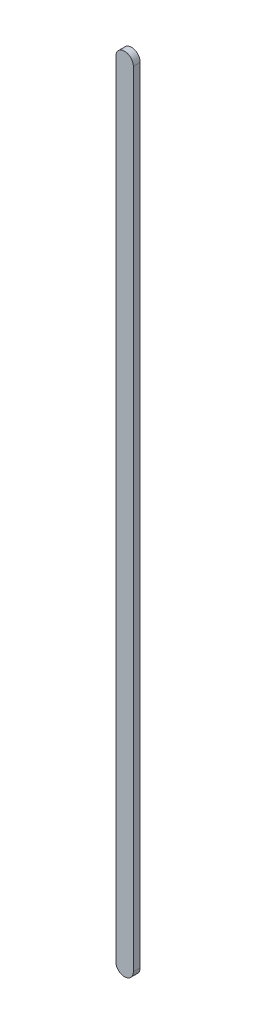
ISO-10303-21;
HEADER;
FILE_DESCRIPTION(('STEP AP214'),'2;1');
FILE_NAME('part.step','',(''),(''),'','','');
FILE_SCHEMA(('AUTOMOTIVE_DESIGN { 1 0 10303 214 1 1 1 1 }'));
ENDSEC;
DATA;
#1=APPLICATION_CONTEXT('core data for automotive mechanical design processes');
#2=APPLICATION_PROTOCOL_DEFINITION('international standard','automotive_design',2000,#1);
#3=PRODUCT_CONTEXT('',#1,'mechanical');
#4=PRODUCT('Part','Part','',(#3));
#5=PRODUCT_RELATED_PRODUCT_CATEGORY('part','',(#4));
#6=PRODUCT_DEFINITION_FORMATION('','',#4);
#7=PRODUCT_DEFINITION_CONTEXT('part definition',#1,'design');
#8=PRODUCT_DEFINITION('design','',#6,#7);
#9=PRODUCT_DEFINITION_SHAPE('','',#8);
#10=(LENGTH_UNIT() NAMED_UNIT(*) SI_UNIT(.MILLI.,.METRE.));
#11=(NAMED_UNIT(*) PLANE_ANGLE_UNIT() SI_UNIT($,.RADIAN.));
#12=(NAMED_UNIT(*) SI_UNIT($,.STERADIAN.) SOLID_ANGLE_UNIT());
#13=UNCERTAINTY_MEASURE_WITH_UNIT(LENGTH_MEASURE(1.E-05),#10,'distance_accuracy_value','');
#14=(GEOMETRIC_REPRESENTATION_CONTEXT(3) GLOBAL_UNCERTAINTY_ASSIGNED_CONTEXT((#13)) GLOBAL_UNIT_ASSIGNED_CONTEXT((#10,
#11,#12)) REPRESENTATION_CONTEXT('',''));
#15=CARTESIAN_POINT('',(0.,0.,0.));
#16=DIRECTION('',(0.,0.,1.));
#17=DIRECTION('',(1.,0.,0.));
#18=AXIS2_PLACEMENT_3D('',#15,#16,#17);
#19=CARTESIAN_POINT('',(87.63,65.151,0.));
#20=DIRECTION('',(-1.,0.,0.));
#21=DIRECTION('',(0.,1.,0.));
#22=AXIS2_PLACEMENT_3D('',#19,#20,#21);
#23=PLANE('',#22);
#24=DIRECTION('',(0.,1.,0.));
#25=VECTOR('',#24,1.);
#26=CARTESIAN_POINT('',(87.63,65.151,0.1999996));
#27=LINE('',#26,#25);
#28=CARTESIAN_POINT('',(87.63,65.151,0.1999996));
#29=VERTEX_POINT('',#28);
#30=CARTESIAN_POINT('',(87.63,87.884,0.1999996));
#31=VERTEX_POINT('',#30);
#32=EDGE_CURVE('E11',#29,#31,#27,.T.);
#33=ORIENTED_EDGE('',*,*,#32,.F.);
#34=DIRECTION('',(0.,0.,1.));
#35=VECTOR('',#34,1.);
#36=CARTESIAN_POINT('',(87.63,65.151,0.));
#37=LINE('',#36,#35);
#38=CARTESIAN_POINT('',(87.63,65.151,0.));
#39=VERTEX_POINT('',#38);
#40=EDGE_CURVE('E24',#39,#29,#37,.T.);
#41=ORIENTED_EDGE('',*,*,#40,.F.);
#42=DIRECTION('',(0.,1.,0.));
#43=VECTOR('',#42,1.);
#44=CARTESIAN_POINT('',(87.63,65.151,0.));
#45=LINE('',#44,#43);
#46=CARTESIAN_POINT('',(87.63,87.884,0.));
#47=VERTEX_POINT('',#46);
#48=EDGE_CURVE('E75',#39,#47,#45,.T.);
#49=ORIENTED_EDGE('',*,*,#48,.T.);
#50=DIRECTION('',(0.,0.,1.));
#51=VECTOR('',#50,1.);
#52=CARTESIAN_POINT('',(87.63,87.884,0.));
#53=LINE('',#52,#51);
#54=EDGE_CURVE('E37',#47,#31,#53,.T.);
#55=ORIENTED_EDGE('',*,*,#54,.T.);
#56=EDGE_LOOP('',(#33,#41,#49,#55));
#57=FACE_BOUND('',#56,.T.);
#58=ADVANCED_FACE('F17',(#57),#23,.F.);
#59=CARTESIAN_POINT('',(87.376,87.884,0.));
#60=DIRECTION('',(0.,0.,-1.));
#61=DIRECTION('',(1.,0.,0.));
#62=AXIS2_PLACEMENT_3D('',#59,#60,#61);
#63=CYLINDRICAL_SURFACE('',#62,0.254);
#64=CARTESIAN_POINT('',(87.376,87.884,0.1999996));
#65=DIRECTION('',(0.,0.,1.));
#66=DIRECTION('',(1.,0.,0.));
#67=AXIS2_PLACEMENT_3D('',#64,#65,#66);
#68=CIRCLE('',#67,0.254);
#69=CARTESIAN_POINT('',(87.122,87.884,0.1999996));
#70=VERTEX_POINT('',#69);
#71=EDGE_CURVE('E83',#31,#70,#68,.T.);
#72=ORIENTED_EDGE('',*,*,#71,.F.);
#73=ORIENTED_EDGE('',*,*,#54,.F.);
#74=CARTESIAN_POINT('',(87.376,87.884,0.));
#75=DIRECTION('',(0.,0.,1.));
#76=DIRECTION('',(1.,0.,0.));
#77=AXIS2_PLACEMENT_3D('',#74,#75,#76);
#78=CIRCLE('',#77,0.254);
#79=CARTESIAN_POINT('',(87.122,87.884,0.));
#80=VERTEX_POINT('',#79);
#81=EDGE_CURVE('E81',#47,#80,#78,.T.);
#82=ORIENTED_EDGE('',*,*,#81,.T.);
#83=DIRECTION('',(0.,0.,1.));
#84=VECTOR('',#83,1.);
#85=CARTESIAN_POINT('',(87.122,87.884,0.));
#86=LINE('',#85,#84);
#87=EDGE_CURVE('E67',#80,#70,#86,.T.);
#88=ORIENTED_EDGE('',*,*,#87,.T.);
#89=EDGE_LOOP('',(#72,#73,#82,#88));
#90=FACE_BOUND('',#89,.T.);
#91=ADVANCED_FACE('F89',(#90),#63,.T.);
#92=CARTESIAN_POINT('',(87.122,87.884,0.));
#93=DIRECTION('',(1.,0.,0.));
#94=DIRECTION('',(0.,-1.,0.));
#95=AXIS2_PLACEMENT_3D('',#92,#93,#94);
#96=PLANE('',#95);
#97=DIRECTION('',(0.,-1.,0.));
#98=VECTOR('',#97,1.);
#99=CARTESIAN_POINT('',(87.122,87.884,0.1999996));
#100=LINE('',#99,#98);
#101=CARTESIAN_POINT('',(87.122,65.151,0.1999996));
#102=VERTEX_POINT('',#101);
#103=EDGE_CURVE('E71',#70,#102,#100,.T.);
#104=ORIENTED_EDGE('',*,*,#103,.F.);
#105=ORIENTED_EDGE('',*,*,#87,.F.);
#106=DIRECTION('',(0.,-1.,0.));
#107=VECTOR('',#106,1.);
#108=CARTESIAN_POINT('',(87.122,87.884,0.));
#109=LINE('',#108,#107);
#110=CARTESIAN_POINT('',(87.122,65.151,0.));
#111=VERTEX_POINT('',#110);
#112=EDGE_CURVE('E63',#80,#111,#109,.T.);
#113=ORIENTED_EDGE('',*,*,#112,.T.);
#114=DIRECTION('',(0.,0.,1.));
#115=VECTOR('',#114,1.);
#116=CARTESIAN_POINT('',(87.122,65.151,0.));
#117=LINE('',#116,#115);
#118=EDGE_CURVE('E53',#111,#102,#117,.T.);
#119=ORIENTED_EDGE('',*,*,#118,.T.);
#120=EDGE_LOOP('',(#104,#105,#113,#119));
#121=FACE_BOUND('',#120,.T.);
#122=ADVANCED_FACE('F66',(#121),#96,.F.);
#123=CARTESIAN_POINT('',(87.376,65.151,0.));
#124=DIRECTION('',(0.,0.,-1.));
#125=DIRECTION('',(-1.,0.,0.));
#126=AXIS2_PLACEMENT_3D('',#123,#124,#125);
#127=CYLINDRICAL_SURFACE('',#126,0.254);
#128=CARTESIAN_POINT('',(87.376,65.151,0.1999996));
#129=DIRECTION('',(0.,0.,1.));
#130=DIRECTION('',(-1.,0.,0.));
#131=AXIS2_PLACEMENT_3D('',#128,#129,#130);
#132=CIRCLE('',#131,0.254);
#133=EDGE_CURVE('E59',#102,#29,#132,.T.);
#134=ORIENTED_EDGE('',*,*,#133,.F.);
#135=ORIENTED_EDGE('',*,*,#118,.F.);
#136=CARTESIAN_POINT('',(87.376,65.151,0.));
#137=DIRECTION('',(0.,0.,1.));
#138=DIRECTION('',(-1.,0.,0.));
#139=AXIS2_PLACEMENT_3D('',#136,#137,#138);
#140=CIRCLE('',#139,0.254);
#141=EDGE_CURVE('E57',#111,#39,#140,.T.);
#142=ORIENTED_EDGE('',*,*,#141,.T.);
#143=ORIENTED_EDGE('',*,*,#40,.T.);
#144=EDGE_LOOP('',(#134,#135,#142,#143));
#145=FACE_BOUND('',#144,.T.);
#146=ADVANCED_FACE('F55',(#145),#127,.T.);
#147=CARTESIAN_POINT('',(87.63,65.151,0.));
#148=DIRECTION('',(0.,0.,-1.));
#149=DIRECTION('',(-1.,0.,0.));
#150=AXIS2_PLACEMENT_3D('',#147,#148,#149);
#151=PLANE('',#150);
#152=ORIENTED_EDGE('',*,*,#141,.F.);
#153=ORIENTED_EDGE('',*,*,#112,.F.);
#154=ORIENTED_EDGE('',*,*,#81,.F.);
#155=ORIENTED_EDGE('',*,*,#48,.F.);
#156=EDGE_LOOP('',(#152,#153,#154,#155));
#157=FACE_BOUND('',#156,.T.);
#158=ADVANCED_FACE('F74',(#157),#151,.T.);
#159=CARTESIAN_POINT('',(87.63,65.151,0.1999996));
#160=DIRECTION('',(0.,0.,-1.));
#161=DIRECTION('',(-1.,0.,0.));
#162=AXIS2_PLACEMENT_3D('',#159,#160,#161);
#163=PLANE('',#162);
#164=ORIENTED_EDGE('',*,*,#32,.T.);
#165=ORIENTED_EDGE('',*,*,#71,.T.);
#166=ORIENTED_EDGE('',*,*,#103,.T.);
#167=ORIENTED_EDGE('',*,*,#133,.T.);
#168=EDGE_LOOP('',(#164,#165,#166,#167));
#169=FACE_BOUND('',#168,.T.);
#170=ADVANCED_FACE('F91',(#169),#163,.F.);
#171=CLOSED_SHELL('',(#58,#91,#122,#146,#158,#170));
#172=MANIFOLD_SOLID_BREP('B1',#171);
#173=ADVANCED_BREP_SHAPE_REPRESENTATION('',(#18,#172),#14);
#174=SHAPE_DEFINITION_REPRESENTATION(#9,#173);
ENDSEC;
END-ISO-10303-21;
